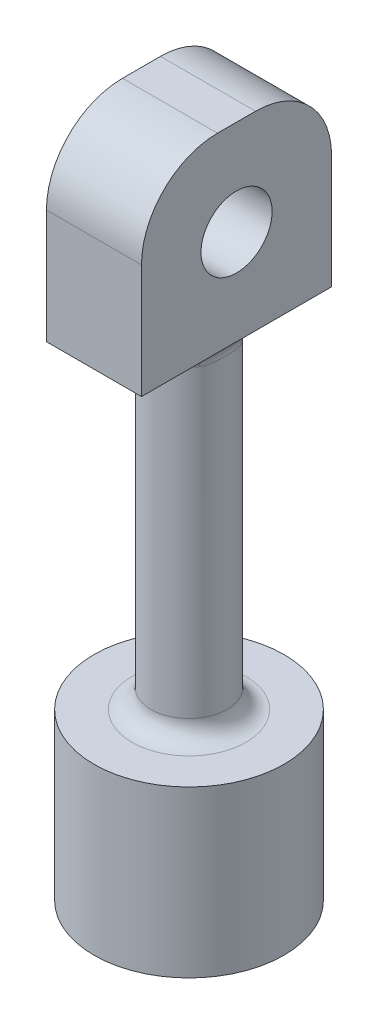
ISO-10303-21;
HEADER;
FILE_DESCRIPTION(('STEP AP214'),'2;1');
FILE_NAME('part.step','',(''),(''),'','','');
FILE_SCHEMA(('AUTOMOTIVE_DESIGN { 1 0 10303 214 1 1 1 1 }'));
ENDSEC;
DATA;
#1=APPLICATION_CONTEXT('core data for automotive mechanical design processes');
#2=APPLICATION_PROTOCOL_DEFINITION('international standard','automotive_design',2000,#1);
#3=PRODUCT_CONTEXT('',#1,'mechanical');
#4=PRODUCT('Part','Part','',(#3));
#5=PRODUCT_RELATED_PRODUCT_CATEGORY('part','',(#4));
#6=PRODUCT_DEFINITION_FORMATION('','',#4);
#7=PRODUCT_DEFINITION_CONTEXT('part definition',#1,'design');
#8=PRODUCT_DEFINITION('design','',#6,#7);
#9=PRODUCT_DEFINITION_SHAPE('','',#8);
#10=(LENGTH_UNIT() NAMED_UNIT(*) SI_UNIT(.MILLI.,.METRE.));
#11=(NAMED_UNIT(*) PLANE_ANGLE_UNIT() SI_UNIT($,.RADIAN.));
#12=(NAMED_UNIT(*) SI_UNIT($,.STERADIAN.) SOLID_ANGLE_UNIT());
#13=UNCERTAINTY_MEASURE_WITH_UNIT(LENGTH_MEASURE(1.E-05),#10,'distance_accuracy_value','');
#14=(GEOMETRIC_REPRESENTATION_CONTEXT(3) GLOBAL_UNCERTAINTY_ASSIGNED_CONTEXT((#13)) GLOBAL_UNIT_ASSIGNED_CONTEXT((#10,
#11,#12)) REPRESENTATION_CONTEXT('',''));
#15=CARTESIAN_POINT('',(0.,0.,0.));
#16=DIRECTION('',(0.,0.,1.));
#17=DIRECTION('',(1.,0.,0.));
#18=AXIS2_PLACEMENT_3D('',#15,#16,#17);
#19=CARTESIAN_POINT('',(0.,1.335,0.));
#20=DIRECTION('',(0.,1.,0.));
#21=DIRECTION('',(0.,0.,1.));
#22=AXIS2_PLACEMENT_3D('',#19,#20,#21);
#23=PLANE('',#22);
#24=DIRECTION('',(0.,0.,-1.));
#25=VECTOR('',#24,1.);
#26=CARTESIAN_POINT('',(0.125,1.335,-0.25));
#27=LINE('',#26,#25);
#28=CARTESIAN_POINT('',(0.125,1.335,-0.082915619758885));
#29=VERTEX_POINT('',#28);
#30=CARTESIAN_POINT('',(0.125,1.335,-0.25));
#31=VERTEX_POINT('',#30);
#32=EDGE_CURVE('E125',#29,#31,#27,.T.);
#33=ORIENTED_EDGE('',*,*,#32,.F.);
#34=CARTESIAN_POINT('',(0.,1.335,0.));
#35=DIRECTION('',(0.,1.,0.));
#36=DIRECTION('',(0.,0.,1.));
#37=AXIS2_PLACEMENT_3D('',#34,#35,#36);
#38=CIRCLE('',#37,0.15);
#39=CARTESIAN_POINT('',(-0.125,1.335,-0.082915619758885));
#40=VERTEX_POINT('',#39);
#41=EDGE_CURVE('E11',#29,#40,#38,.T.);
#42=ORIENTED_EDGE('',*,*,#41,.T.);
#43=DIRECTION('',(0.,0.,1.));
#44=VECTOR('',#43,1.);
#45=CARTESIAN_POINT('',(-0.125,1.335,-0.25));
#46=LINE('',#45,#44);
#47=CARTESIAN_POINT('',(-0.125,1.335,-0.25));
#48=VERTEX_POINT('',#47);
#49=EDGE_CURVE('E149',#48,#40,#46,.T.);
#50=ORIENTED_EDGE('',*,*,#49,.F.);
#51=DIRECTION('',(-1.,0.,0.));
#52=VECTOR('',#51,1.);
#53=CARTESIAN_POINT('',(-0.125,1.335,-0.25));
#54=LINE('',#53,#52);
#55=EDGE_CURVE('E142',#31,#48,#54,.T.);
#56=ORIENTED_EDGE('',*,*,#55,.F.);
#57=EDGE_LOOP('',(#33,#42,#50,#56));
#58=FACE_BOUND('',#57,.T.);
#59=ADVANCED_FACE('F41',(#58),#23,.F.);
#60=CARTESIAN_POINT('',(0.,0.435,0.));
#61=DIRECTION('',(0.,-1.,0.));
#62=DIRECTION('',(0.,0.,-1.));
#63=AXIS2_PLACEMENT_3D('',#60,#61,#62);
#64=CYLINDRICAL_SURFACE('',#63,0.25);
#65=CARTESIAN_POINT('',(0.,0.435,0.));
#66=DIRECTION('',(0.,1.,0.));
#67=DIRECTION('',(0.,0.,1.));
#68=AXIS2_PLACEMENT_3D('',#65,#66,#67);
#69=CIRCLE('',#68,0.25);
#70=CARTESIAN_POINT('',(0.,0.435,0.25));
#71=VERTEX_POINT('',#70);
#72=EDGE_CURVE('E174',#71,#71,#69,.T.);
#73=ORIENTED_EDGE('',*,*,#72,.F.);
#74=EDGE_LOOP('',(#73));
#75=FACE_BOUND('',#74,.T.);
#76=CARTESIAN_POINT('',(0.,0.,0.));
#77=DIRECTION('',(0.,1.,0.));
#78=DIRECTION('',(0.,0.,1.));
#79=AXIS2_PLACEMENT_3D('',#76,#77,#78);
#80=CIRCLE('',#79,0.25);
#81=CARTESIAN_POINT('',(0.,0.,0.25));
#82=VERTEX_POINT('',#81);
#83=EDGE_CURVE('E146',#82,#82,#80,.T.);
#84=ORIENTED_EDGE('',*,*,#83,.T.);
#85=EDGE_LOOP('',(#84));
#86=FACE_BOUND('',#85,.T.);
#87=ADVANCED_FACE('F361',(#75,#86),#64,.T.);
#88=CARTESIAN_POINT('',(0.,0.435,0.));
#89=DIRECTION('',(0.,1.,0.));
#90=DIRECTION('',(0.,0.,1.));
#91=AXIS2_PLACEMENT_3D('',#88,#89,#90);
#92=PLANE('',#91);
#93=CARTESIAN_POINT('',(0.,0.435,0.));
#94=DIRECTION('',(0.,1.,0.));
#95=DIRECTION('',(0.,0.,1.));
#96=AXIS2_PLACEMENT_3D('',#93,#94,#95);
#97=CIRCLE('',#96,0.15);
#98=CARTESIAN_POINT('',(0.,0.435,0.15));
#99=VERTEX_POINT('',#98);
#100=EDGE_CURVE('E303',#99,#99,#97,.F.);
#101=ORIENTED_EDGE('',*,*,#100,.T.);
#102=EDGE_LOOP('',(#101));
#103=FACE_BOUND('',#102,.T.);
#104=ORIENTED_EDGE('',*,*,#72,.T.);
#105=EDGE_LOOP('',(#104));
#106=FACE_BOUND('',#105,.T.);
#107=ADVANCED_FACE('F365',(#103,#106),#92,.T.);
#108=CARTESIAN_POINT('',(0.,0.,0.));
#109=DIRECTION('',(0.,1.,0.));
#110=DIRECTION('',(0.,0.,1.));
#111=AXIS2_PLACEMENT_3D('',#108,#109,#110);
#112=PLANE('',#111);
#113=ORIENTED_EDGE('',*,*,#83,.F.);
#114=EDGE_LOOP('',(#113));
#115=FACE_BOUND('',#114,.T.);
#116=ADVANCED_FACE('F370',(#115),#112,.F.);
#117=CARTESIAN_POINT('',(0.,1.335,0.));
#118=DIRECTION('',(0.,-1.,0.));
#119=DIRECTION('',(0.,0.,-1.));
#120=AXIS2_PLACEMENT_3D('',#117,#118,#119);
#121=CYLINDRICAL_SURFACE('',#120,0.1);
#122=CARTESIAN_POINT('',(0.,0.485,0.));
#123=DIRECTION('',(0.,1.,0.));
#124=DIRECTION('',(0.,0.,1.));
#125=AXIS2_PLACEMENT_3D('',#122,#123,#124);
#126=CIRCLE('',#125,0.1);
#127=CARTESIAN_POINT('',(0.,0.485,0.1));
#128=VERTEX_POINT('',#127);
#129=EDGE_CURVE('E307',#128,#128,#126,.T.);
#130=ORIENTED_EDGE('',*,*,#129,.T.);
#131=EDGE_LOOP('',(#130));
#132=FACE_BOUND('',#131,.T.);
#133=CARTESIAN_POINT('',(0.125,1.335,0.10856194725713));
#134=CARTESIAN_POINT('',(0.0850096782033544,1.35403583939084,0.0571162837268185));
#135=CARTESIAN_POINT('',(0.0690066135566093,1.28985383210074,0.072374631504753));
#136=CARTESIAN_POINT('',(0.125,1.335,0.105724168479342));
#137=CARTESIAN_POINT('',(0.0831957017639459,1.35170316919863,0.0580099933726405));
#138=CARTESIAN_POINT('',(0.0709959026641307,1.28843725584,0.070482778852119));
#139=CARTESIAN_POINT('',(0.125,1.335,0.102686668673819));
#140=CARTESIAN_POINT('',(0.0821809890806206,1.3490566128786,0.0584911358428412));
#141=CARTESIAN_POINT('',(0.0729507240944738,1.28739704937079,0.068457778960996));
#142=CARTESIAN_POINT('',(0.125,1.335,0.0963280489440128));
#143=CARTESIAN_POINT('',(0.0813724435440272,1.34388055681319,0.0585295506126141));
#144=CARTESIAN_POINT('',(0.0767054050172057,1.28591300630558,0.0642186991875025));
#145=CARTESIAN_POINT('',(0.125,1.335,0.093010538036136));
#146=CARTESIAN_POINT('',(0.0815131281205083,1.34135099110951,0.0581370739161317));
#147=CARTESIAN_POINT('',(0.078506771072767,1.28546253713962,0.0620070253150749));
#148=CARTESIAN_POINT('',(0.125,1.335,0.079010373943791));
#149=CARTESIAN_POINT('',(0.0834408034538218,1.33252361073601,0.0549034565275015));
#150=CARTESIAN_POINT('',(0.0854546022267336,1.28447308816901,0.0526735827594278));
#151=CARTESIAN_POINT('',(0.125,1.335,0.0673305657156687));
#152=CARTESIAN_POINT('',(0.0878162809667357,1.32764063347322,0.0488214738654433));
#153=CARTESIAN_POINT('',(0.0897851364635703,1.2856904332384,0.0448870438457601));
#154=CARTESIAN_POINT('',(0.125,1.335,0.0419979719113134));
#155=CARTESIAN_POINT('',(0.0950731532254085,1.32205084868934,0.0325534403305839));
#156=CARTESIAN_POINT('',(0.0964624191727258,1.28871923767388,0.0279986479032153));
#157=CARTESIAN_POINT('',(0.125,1.335,0.0282656627721752));
#158=CARTESIAN_POINT('',(0.0981925457759284,1.32111017020412,0.0219583922863398));
#159=CARTESIAN_POINT('',(0.0986582681023731,1.29056479303117,0.0188437751739174));
#160=CARTESIAN_POINT('',(0.125,1.335,0.0060122880577856));
#161=CARTESIAN_POINT('',(0.100097798358669,1.3205377690155,0.00474353422635026));
#162=CARTESIAN_POINT('',(0.100070499657983,1.29175447310882,0.0040081920429704));
#163=CARTESIAN_POINT('',(0.125,1.335,-0.00233894965746526));
#164=CARTESIAN_POINT('',(0.100179601405312,1.32051436326207,-0.00186314624087899));
#165=CARTESIAN_POINT('',(0.100138958115663,1.29181362539728,-0.001559299770624));
#166=CARTESIAN_POINT('',(0.125,1.335,-0.0189187693969847));
#167=CARTESIAN_POINT('',(0.0991471678284061,1.32081738622414,-0.0147012696194528));
#168=CARTESIAN_POINT('',(0.0993583161004837,1.2911528195719,-0.0126125129323461));
#169=CARTESIAN_POINT('',(0.125,1.335,-0.0271468464963167));
#170=CARTESIAN_POINT('',(0.09800656351114,1.32115153864871,-0.0210673364630614));
#171=CARTESIAN_POINT('',(0.0985061394611567,1.29043024943636,-0.0180978976638331));
#172=CARTESIAN_POINT('',(0.125,1.335,-0.0498614216109878));
#173=CARTESIAN_POINT('',(0.0933198913233842,1.32333549353212,-0.0378399985182552));
#174=CARTESIAN_POINT('',(0.0948434884943917,1.28791072842075,-0.0332409477413298));
#175=CARTESIAN_POINT('',(0.125,1.335,-0.0639884873456299));
#176=CARTESIAN_POINT('',(0.0883269820611773,1.32638135684997,-0.047385215565398));
#177=CARTESIAN_POINT('',(0.0910034571124553,1.28571803082568,-0.0426589915709393));
#178=CARTESIAN_POINT('',(0.125,1.335,-0.0809757940422197));
#179=CARTESIAN_POINT('',(0.0837571812340695,1.33386561831596,-0.0546992775339377));
#180=CARTESIAN_POINT('',(0.0842347574640492,1.28496235421669,-0.0539838626925906));
#181=CARTESIAN_POINT('',(0.125,1.335,-0.084878315980881));
#182=CARTESIAN_POINT('',(0.0827685593921063,1.336056110028,-0.0561085584009458));
#183=CARTESIAN_POINT('',(0.0825086489906885,1.28493837909165,-0.0565855439814985));
#184=CARTESIAN_POINT('',(0.125,1.335,-0.0924270554819607));
#185=CARTESIAN_POINT('',(0.0815225350568603,1.34093492876437,-0.0580616156547578));
#186=CARTESIAN_POINT('',(0.0788230421730658,1.28538233300948,-0.0616180369797594));
#187=CARTESIAN_POINT('',(0.125,1.335,-0.0960716871019849));
#188=CARTESIAN_POINT('',(0.0813039904972026,1.34365472343558,-0.0585598165198814));
#189=CARTESIAN_POINT('',(0.0768622708565444,1.28585306376332,-0.0640477913942094));
#190=CARTESIAN_POINT('',(0.125,1.335,-0.099546749880505));
#191=CARTESIAN_POINT('',(0.0817726615139244,1.34644082893277,-0.0585104253278344));
#192=CARTESIAN_POINT('',(0.0748047668957242,1.28666426789974,-0.0663644999203366));
#193=(BOUNDED_SURFACE() B_SPLINE_SURFACE(3,2,((#133,#134,#135),(#136,#137,#138),(#139,#140,
#141),(#142,#143,#144),(#145,#146,#147),(#148,#149,#150),(#151,#152,#153),(#154,#155,#156),
(#157,#158,#159),(#160,#161,#162),(#163,#164,#165),(#166,#167,#168),(#169,#170,#171),(#172,#173,
#174),(#175,#176,#177),(#178,#179,#180),(#181,#182,#183),(#184,#185,#186),(#187,#188,#189),
(#190,#191,#192)),.UNSPECIFIED.,.F.,.F.,.F.) B_SPLINE_SURFACE_WITH_KNOTS((4,2,2,2,2,2,2,2,2,4),
(3,3),(0.,0.0130040609143609,0.0258605762789966,0.0653974877027271,0.107560932638332,
0.132451060517195,0.157424613048316,0.202733269596913,0.216746329476958,0.230839180611311),(0.,
1.),.UNSPECIFIED.) GEOMETRIC_REPRESENTATION_ITEM() RATIONAL_B_SPLINE_SURFACE(((1.,
0.59304657298147,1.),(1.,0.606779462805589,1.),(1.,0.621334840894185,1.),(1.,0.650726469007366,
1.),(1.,0.665557658450866,1.),(1.,0.724535947416547,1.),(1.,0.765648180301429,1.),(1.,
0.830297574603736,1.),(1.,0.852485741784741,1.),(1.,0.866736952772142,1.),(1.,0.867417588593249,
1.),(1.,0.859557397145546,1.),(1.,0.850985654500493,1.),(1.,0.814457334485753,1.),(1.,
0.776399662582596,1.),(1.,0.715014348013355,1.),(1.,0.699669472161448,1.),(1.,0.668137116196066,
1.),(1.,0.651945335757425,1.),(1.,0.635848556145245,1.))) REPRESENTATION_ITEM('') SURFACE());
#194=CARTESIAN_POINT('',(0.0748047668957242,1.28666426789974,-0.0663644999203366));
#195=CARTESIAN_POINT('',(0.0768622708565444,1.28585306376332,-0.0640477913942094));
#196=CARTESIAN_POINT('',(0.0788230421730658,1.28538233300948,-0.0616180369797594));
#197=CARTESIAN_POINT('',(0.0825086489906885,1.28493837909165,-0.0565855439814985));
#198=CARTESIAN_POINT('',(0.0842347574640492,1.28496235421669,-0.0539838626925906));
#199=CARTESIAN_POINT('',(0.0910034571124553,1.28571803082568,-0.0426589915709393));
#200=CARTESIAN_POINT('',(0.0948434884943917,1.28791072842075,-0.0332409477413298));
#201=CARTESIAN_POINT('',(0.0985061394611568,1.29043024943636,-0.0180978976638331));
#202=CARTESIAN_POINT('',(0.0993583161004837,1.2911528195719,-0.0126125129323461));
#203=CARTESIAN_POINT('',(0.100138958115663,1.29181362539728,-0.001559299770624));
#204=CARTESIAN_POINT('',(0.100070499657983,1.29175447310882,0.00400819204297041));
#205=CARTESIAN_POINT('',(0.0986582681023731,1.29056479303117,0.0188437751739174));
#206=CARTESIAN_POINT('',(0.0964624191727258,1.28871923767388,0.0279986479032153));
#207=CARTESIAN_POINT('',(0.0897851364635703,1.2856904332384,0.0448870438457601));
#208=CARTESIAN_POINT('',(0.0854546022267336,1.28447308816901,0.0526735827594279));
#209=CARTESIAN_POINT('',(0.078506771072767,1.28546253713962,0.0620070253150749));
#210=CARTESIAN_POINT('',(0.0767054050172057,1.28591300630558,0.0642186991875025));
#211=CARTESIAN_POINT('',(0.0729507240944738,1.28739704937079,0.0684577789609959));
#212=CARTESIAN_POINT('',(0.0709959026641307,1.28843725584,0.070482778852119));
#213=CARTESIAN_POINT('',(0.0690066135566093,1.28985383210074,0.072374631504753));
#214=B_SPLINE_CURVE_WITH_KNOTS('',3,(#194,#195,#196,#197,#198,#199,#200,#201,#202,#203,#204,
#205,#206,#207,#208,#209,#210,#211,#212,#213),.UNSPECIFIED.,.F.,.F.,(4,2,2,2,2,2,2,2,2,4),(0.,
0.0140928511343531,0.0281059110143974,0.0734145675629953,0.0983881200941162,0.123278247972978,
0.165441692908584,0.204978604332314,0.21783511969695,0.230839180611311),.UNSPECIFIED.);
#215=CARTESIAN_POINT('',(0.0833333333333333,1.285,-0.0552770798392567));
#216=VERTEX_POINT('',#215);
#217=CARTESIAN_POINT('',(0.0833333333333333,1.285,0.0552770798392567));
#218=VERTEX_POINT('',#217);
#219=EDGE_CURVE('E206',#216,#218,#214,.T.);
#220=ORIENTED_EDGE('',*,*,#219,.T.);
#221=CARTESIAN_POINT('',(0.,1.285,0.));
#222=DIRECTION('',(0.,1.,0.));
#223=DIRECTION('',(0.,0.,1.));
#224=AXIS2_PLACEMENT_3D('',#221,#222,#223);
#225=CIRCLE('',#224,0.1);
#226=CARTESIAN_POINT('',(-0.0833333333333333,1.285,0.0552770798392567));
#227=VERTEX_POINT('',#226);
#228=EDGE_CURVE('E311',#218,#227,#225,.F.);
#229=ORIENTED_EDGE('',*,*,#228,.T.);
#230=CARTESIAN_POINT('',(-0.125,1.335,-0.10856194725713));
#231=CARTESIAN_POINT('',(-0.0850096782033544,1.35403583939084,-0.0571162837268185));
#232=CARTESIAN_POINT('',(-0.0690066135566093,1.28985383210074,-0.072374631504753));
#233=CARTESIAN_POINT('',(-0.125,1.335,-0.105724168479342));
#234=CARTESIAN_POINT('',(-0.0831957017639459,1.35170316919863,-0.0580099933726406));
#235=CARTESIAN_POINT('',(-0.0709959026641307,1.28843725584,-0.070482778852119));
#236=CARTESIAN_POINT('',(-0.125,1.335,-0.102686668673819));
#237=CARTESIAN_POINT('',(-0.0821809890806206,1.3490566128786,-0.0584911358428412));
#238=CARTESIAN_POINT('',(-0.0729507240944738,1.28739704937079,-0.068457778960996));
#239=CARTESIAN_POINT('',(-0.125,1.335,-0.0963280489440128));
#240=CARTESIAN_POINT('',(-0.0813724435440272,1.34388055681319,-0.0585295506126141));
#241=CARTESIAN_POINT('',(-0.0767054050172057,1.28591300630558,-0.0642186991875025));
#242=CARTESIAN_POINT('',(-0.125,1.335,-0.093010538036136));
#243=CARTESIAN_POINT('',(-0.0815131281205083,1.34135099110951,-0.0581370739161317));
#244=CARTESIAN_POINT('',(-0.078506771072767,1.28546253713962,-0.0620070253150749));
#245=CARTESIAN_POINT('',(-0.125,1.335,-0.079010373943791));
#246=CARTESIAN_POINT('',(-0.0834408034538218,1.33252361073601,-0.0549034565275015));
#247=CARTESIAN_POINT('',(-0.0854546022267337,1.28447308816901,-0.0526735827594278));
#248=CARTESIAN_POINT('',(-0.125,1.335,-0.0673305657156687));
#249=CARTESIAN_POINT('',(-0.0878162809667357,1.32764063347322,-0.0488214738654433));
#250=CARTESIAN_POINT('',(-0.0897851364635703,1.2856904332384,-0.04488704384576));
#251=CARTESIAN_POINT('',(-0.125,1.335,-0.0419979719113133));
#252=CARTESIAN_POINT('',(-0.0950731532254085,1.32205084868934,-0.0325534403305839));
#253=CARTESIAN_POINT('',(-0.0964624191727258,1.28871923767388,-0.0279986479032152));
#254=CARTESIAN_POINT('',(-0.125,1.335,-0.0282656627721752));
#255=CARTESIAN_POINT('',(-0.0981925457759284,1.32111017020412,-0.0219583922863398));
#256=CARTESIAN_POINT('',(-0.0986582681023731,1.29056479303117,-0.0188437751739173));
#257=CARTESIAN_POINT('',(-0.125,1.335,-0.00601228805778554));
#258=CARTESIAN_POINT('',(-0.100097798358669,1.3205377690155,-0.00474353422635021));
#259=CARTESIAN_POINT('',(-0.100070499657983,1.29175447310882,-0.00400819204297037));
#260=CARTESIAN_POINT('',(-0.125,1.335,0.00233894965746531));
#261=CARTESIAN_POINT('',(-0.100179601405312,1.32051436326207,0.00186314624087904));
#262=CARTESIAN_POINT('',(-0.100138958115663,1.29181362539728,0.00155929977062404));
#263=CARTESIAN_POINT('',(-0.125,1.335,0.0189187693969848));
#264=CARTESIAN_POINT('',(-0.0991471678284061,1.32081738622414,0.0147012696194528));
#265=CARTESIAN_POINT('',(-0.0993583161004837,1.2911528195719,0.0126125129323461));
#266=CARTESIAN_POINT('',(-0.125,1.335,0.0271468464963167));
#267=CARTESIAN_POINT('',(-0.09800656351114,1.32115153864871,0.0210673364630614));
#268=CARTESIAN_POINT('',(-0.0985061394611568,1.29043024943636,0.0180978976638331));
#269=CARTESIAN_POINT('',(-0.125,1.335,0.0498614216109879));
#270=CARTESIAN_POINT('',(-0.0933198913233842,1.32333549353212,0.0378399985182553));
#271=CARTESIAN_POINT('',(-0.0948434884943917,1.28791072842075,0.0332409477413298));
#272=CARTESIAN_POINT('',(-0.125,1.335,0.06398848734563));
#273=CARTESIAN_POINT('',(-0.0883269820611773,1.32638135684997,0.0473852155653981));
#274=CARTESIAN_POINT('',(-0.0910034571124553,1.28571803082568,0.0426589915709394));
#275=CARTESIAN_POINT('',(-0.125,1.335,0.0809757940422198));
#276=CARTESIAN_POINT('',(-0.0837571812340695,1.33386561831596,0.0546992775339377));
#277=CARTESIAN_POINT('',(-0.0842347574640492,1.28496235421669,0.0539838626925907));
#278=CARTESIAN_POINT('',(-0.125,1.335,0.084878315980881));
#279=CARTESIAN_POINT('',(-0.0827685593921063,1.336056110028,0.0561085584009458));
#280=CARTESIAN_POINT('',(-0.0825086489906885,1.28493837909165,0.0565855439814984));
#281=CARTESIAN_POINT('',(-0.125,1.335,0.0924270554819607));
#282=CARTESIAN_POINT('',(-0.0815225350568603,1.34093492876437,0.0580616156547578));
#283=CARTESIAN_POINT('',(-0.0788230421730658,1.28538233300948,0.0616180369797594));
#284=CARTESIAN_POINT('',(-0.125,1.335,0.0960716871019849));
#285=CARTESIAN_POINT('',(-0.0813039904972027,1.34365472343558,0.0585598165198814));
#286=CARTESIAN_POINT('',(-0.0768622708565444,1.28585306376332,0.0640477913942094));
#287=CARTESIAN_POINT('',(-0.125,1.335,0.099546749880505));
#288=CARTESIAN_POINT('',(-0.0817726615139244,1.34644082893277,0.0585104253278344));
#289=CARTESIAN_POINT('',(-0.0748047668957242,1.28666426789974,0.0663644999203367));
#290=(BOUNDED_SURFACE() B_SPLINE_SURFACE(3,2,((#230,#231,#232),(#233,#234,#235),(#236,#237,
#238),(#239,#240,#241),(#242,#243,#244),(#245,#246,#247),(#248,#249,#250),(#251,#252,#253),
(#254,#255,#256),(#257,#258,#259),(#260,#261,#262),(#263,#264,#265),(#266,#267,#268),(#269,#270,
#271),(#272,#273,#274),(#275,#276,#277),(#278,#279,#280),(#281,#282,#283),(#284,#285,#286),
(#287,#288,#289)),.UNSPECIFIED.,.F.,.F.,.F.) B_SPLINE_SURFACE_WITH_KNOTS((4,2,2,2,2,2,2,2,2,4),
(3,3),(0.,0.0130040609143609,0.0258605762789966,0.0653974877027272,0.107560932638332,
0.132451060517195,0.157424613048316,0.202733269596913,0.216746329476958,0.230839180611311),(0.,
1.),.UNSPECIFIED.) GEOMETRIC_REPRESENTATION_ITEM() RATIONAL_B_SPLINE_SURFACE(((1.,
0.59304657298147,1.),(1.,0.606779462805589,1.),(1.,0.621334840894185,1.),(1.,0.650726469007367,
1.),(1.,0.665557658450866,1.),(1.,0.724535947416548,1.),(1.,0.765648180301429,1.),(1.,
0.830297574603736,1.),(1.,0.852485741784741,1.),(1.,0.866736952772142,1.),(1.,0.867417588593249,
1.),(1.,0.859557397145546,1.),(1.,0.850985654500493,1.),(1.,0.814457334485753,1.),(1.,
0.776399662582596,1.),(1.,0.715014348013355,1.),(1.,0.699669472161448,1.),(1.,0.668137116196066,
1.),(1.,0.651945335757425,1.),(1.,0.635848556145245,1.))) REPRESENTATION_ITEM('') SURFACE());
#291=CARTESIAN_POINT('',(-0.0748047668957242,1.28666426789974,0.0663644999203367));
#292=CARTESIAN_POINT('',(-0.0768622708565444,1.28585306376332,0.0640477913942094));
#293=CARTESIAN_POINT('',(-0.0788230421730658,1.28538233300948,0.0616180369797594));
#294=CARTESIAN_POINT('',(-0.0825086489906885,1.28493837909165,0.0565855439814985));
#295=CARTESIAN_POINT('',(-0.0842347574640492,1.28496235421669,0.0539838626925907));
#296=CARTESIAN_POINT('',(-0.0910034571124553,1.28571803082568,0.0426589915709394));
#297=CARTESIAN_POINT('',(-0.0948434884943917,1.28791072842075,0.0332409477413298));
#298=CARTESIAN_POINT('',(-0.0985061394611568,1.29043024943636,0.0180978976638331));
#299=CARTESIAN_POINT('',(-0.0993583161004837,1.2911528195719,0.0126125129323461));
#300=CARTESIAN_POINT('',(-0.100138958115663,1.29181362539728,0.00155929977062404));
#301=CARTESIAN_POINT('',(-0.100070499657983,1.29175447310882,-0.00400819204297037));
#302=CARTESIAN_POINT('',(-0.0986582681023731,1.29056479303117,-0.0188437751739173));
#303=CARTESIAN_POINT('',(-0.0964624191727258,1.28871923767388,-0.0279986479032152));
#304=CARTESIAN_POINT('',(-0.0897851364635703,1.2856904332384,-0.04488704384576));
#305=CARTESIAN_POINT('',(-0.0854546022267337,1.28447308816901,-0.0526735827594279));
#306=CARTESIAN_POINT('',(-0.078506771072767,1.28546253713962,-0.0620070253150749));
#307=CARTESIAN_POINT('',(-0.0767054050172057,1.28591300630558,-0.0642186991875025));
#308=CARTESIAN_POINT('',(-0.0729507240944738,1.28739704937079,-0.0684577789609959));
#309=CARTESIAN_POINT('',(-0.0709959026641307,1.28843725584,-0.070482778852119));
#310=CARTESIAN_POINT('',(-0.0690066135566093,1.28985383210074,-0.072374631504753));
#311=B_SPLINE_CURVE_WITH_KNOTS('',3,(#291,#292,#293,#294,#295,#296,#297,#298,#299,#300,#301,
#302,#303,#304,#305,#306,#307,#308,#309,#310),.UNSPECIFIED.,.F.,.F.,(4,2,2,2,2,2,2,2,2,4),(0.,
0.0140928511343532,0.0281059110143974,0.0734145675629953,0.0983881200941162,0.123278247972978,
0.165441692908584,0.204978604332314,0.21783511969695,0.230839180611311),.UNSPECIFIED.);
#312=CARTESIAN_POINT('',(-0.0833333333333333,1.285,-0.0552770798392567));
#313=VERTEX_POINT('',#312);
#314=EDGE_CURVE('E313',#227,#313,#311,.T.);
#315=ORIENTED_EDGE('',*,*,#314,.T.);
#316=CARTESIAN_POINT('',(0.,1.285,0.));
#317=DIRECTION('',(0.,1.,0.));
#318=DIRECTION('',(0.,0.,1.));
#319=AXIS2_PLACEMENT_3D('',#316,#317,#318);
#320=CIRCLE('',#319,0.1);
#321=EDGE_CURVE('E216',#313,#216,#320,.F.);
#322=ORIENTED_EDGE('',*,*,#321,.T.);
#323=EDGE_LOOP('',(#220,#229,#315,#322));
#324=FACE_BOUND('',#323,.T.);
#325=ADVANCED_FACE('F218',(#132,#324),#121,.T.);
#326=CARTESIAN_POINT('',(0.125,1.835,-0.25));
#327=DIRECTION('',(-1.,0.,0.));
#328=DIRECTION('',(0.,0.,1.));
#329=AXIS2_PLACEMENT_3D('',#326,#327,#328);
#330=PLANE('',#329);
#331=CARTESIAN_POINT('',(0.125,1.585,0.));
#332=DIRECTION('',(1.,0.,0.));
#333=DIRECTION('',(0.,0.,-1.));
#334=AXIS2_PLACEMENT_3D('',#331,#332,#333);
#335=CIRCLE('',#334,0.0935);
#336=CARTESIAN_POINT('',(0.125,1.585,-0.0934999999999999));
#337=VERTEX_POINT('',#336);
#338=EDGE_CURVE('E282',#337,#337,#335,.T.);
#339=ORIENTED_EDGE('',*,*,#338,.F.);
#340=EDGE_LOOP('',(#339));
#341=FACE_BOUND('',#340,.T.);
#342=DIRECTION('',(0.,-1.,0.));
#343=VECTOR('',#342,1.);
#344=CARTESIAN_POINT('',(0.125,1.835,-0.25));
#345=LINE('',#344,#343);
#346=CARTESIAN_POINT('',(0.125,1.635,-0.25));
#347=VERTEX_POINT('',#346);
#348=EDGE_CURVE('E128',#347,#31,#345,.T.);
#349=ORIENTED_EDGE('',*,*,#348,.F.);
#350=CARTESIAN_POINT('',(0.125,1.635,-0.0499999999999999));
#351=DIRECTION('',(-1.,0.,0.));
#352=DIRECTION('',(0.,0.,1.));
#353=AXIS2_PLACEMENT_3D('',#350,#351,#352);
#354=CIRCLE('',#353,0.2);
#355=CARTESIAN_POINT('',(0.125,1.835,-0.0499999999999999));
#356=VERTEX_POINT('',#355);
#357=EDGE_CURVE('E200',#347,#356,#354,.F.);
#358=ORIENTED_EDGE('',*,*,#357,.T.);
#359=DIRECTION('',(0.,0.,-1.));
#360=VECTOR('',#359,1.);
#361=CARTESIAN_POINT('',(0.125,1.835,-0.25));
#362=LINE('',#361,#360);
#363=CARTESIAN_POINT('',(0.125,1.835,0.0500000000000001));
#364=VERTEX_POINT('',#363);
#365=EDGE_CURVE('E163',#364,#356,#362,.T.);
#366=ORIENTED_EDGE('',*,*,#365,.F.);
#367=CARTESIAN_POINT('',(0.125,1.635,0.0500000000000001));
#368=DIRECTION('',(-1.,0.,0.));
#369=DIRECTION('',(0.,0.,1.));
#370=AXIS2_PLACEMENT_3D('',#367,#368,#369);
#371=CIRCLE('',#370,0.2);
#372=CARTESIAN_POINT('',(0.125,1.635,0.25));
#373=VERTEX_POINT('',#372);
#374=EDGE_CURVE('E197',#364,#373,#371,.F.);
#375=ORIENTED_EDGE('',*,*,#374,.T.);
#376=DIRECTION('',(0.,-1.,0.));
#377=VECTOR('',#376,1.);
#378=CARTESIAN_POINT('',(0.125,1.835,0.25));
#379=LINE('',#378,#377);
#380=CARTESIAN_POINT('',(0.125,1.335,0.25));
#381=VERTEX_POINT('',#380);
#382=EDGE_CURVE('E164',#373,#381,#379,.T.);
#383=ORIENTED_EDGE('',*,*,#382,.T.);
#384=CARTESIAN_POINT('',(0.125,1.335,0.082915619758885));
#385=VERTEX_POINT('',#384);
#386=EDGE_CURVE('E137',#381,#385,#27,.T.);
#387=ORIENTED_EDGE('',*,*,#386,.T.);
#388=EDGE_CURVE('E132',#385,#29,#27,.T.);
#389=ORIENTED_EDGE('',*,*,#388,.T.);
#390=ORIENTED_EDGE('',*,*,#32,.T.);
#391=EDGE_LOOP('',(#349,#358,#366,#375,#383,#387,#389,#390));
#392=FACE_BOUND('',#391,.T.);
#393=ADVANCED_FACE('F127',(#341,#392),#330,.F.);
#394=CARTESIAN_POINT('',(-0.125,1.835,-0.25));
#395=DIRECTION('',(0.,0.,1.));
#396=DIRECTION('',(1.,0.,0.));
#397=AXIS2_PLACEMENT_3D('',#394,#395,#396);
#398=PLANE('',#397);
#399=DIRECTION('',(0.,-1.,0.));
#400=VECTOR('',#399,1.);
#401=CARTESIAN_POINT('',(-0.125,1.835,-0.25));
#402=LINE('',#401,#400);
#403=CARTESIAN_POINT('',(-0.125,1.635,-0.25));
#404=VERTEX_POINT('',#403);
#405=EDGE_CURVE('E147',#404,#48,#402,.T.);
#406=ORIENTED_EDGE('',*,*,#405,.F.);
#407=DIRECTION('',(-1.,0.,0.));
#408=VECTOR('',#407,1.);
#409=CARTESIAN_POINT('',(0.125,1.635,-0.25));
#410=LINE('',#409,#408);
#411=EDGE_CURVE('E144',#404,#347,#410,.F.);
#412=ORIENTED_EDGE('',*,*,#411,.T.);
#413=ORIENTED_EDGE('',*,*,#348,.T.);
#414=ORIENTED_EDGE('',*,*,#55,.T.);
#415=EDGE_LOOP('',(#406,#412,#413,#414));
#416=FACE_BOUND('',#415,.T.);
#417=ADVANCED_FACE('F141',(#416),#398,.F.);
#418=CARTESIAN_POINT('',(-0.125,1.835,-0.25));
#419=DIRECTION('',(1.,0.,0.));
#420=DIRECTION('',(0.,0.,-1.));
#421=AXIS2_PLACEMENT_3D('',#418,#419,#420);
#422=PLANE('',#421);
#423=CARTESIAN_POINT('',(-0.125,1.585,0.));
#424=DIRECTION('',(1.,0.,0.));
#425=DIRECTION('',(0.,0.,-1.));
#426=AXIS2_PLACEMENT_3D('',#423,#424,#425);
#427=CIRCLE('',#426,0.0935);
#428=CARTESIAN_POINT('',(-0.125,1.585,-0.0934999999999998));
#429=VERTEX_POINT('',#428);
#430=EDGE_CURVE('E135',#429,#429,#427,.T.);
#431=ORIENTED_EDGE('',*,*,#430,.T.);
#432=EDGE_LOOP('',(#431));
#433=FACE_BOUND('',#432,.T.);
#434=DIRECTION('',(0.,0.,1.));
#435=VECTOR('',#434,1.);
#436=CARTESIAN_POINT('',(-0.125,1.835,-0.25));
#437=LINE('',#436,#435);
#438=CARTESIAN_POINT('',(-0.125,1.835,-0.0499999999999999));
#439=VERTEX_POINT('',#438);
#440=CARTESIAN_POINT('',(-0.125,1.835,0.0500000000000001));
#441=VERTEX_POINT('',#440);
#442=EDGE_CURVE('E168',#439,#441,#437,.T.);
#443=ORIENTED_EDGE('',*,*,#442,.F.);
#444=CARTESIAN_POINT('',(-0.125,1.635,-0.0499999999999999));
#445=DIRECTION('',(1.,0.,0.));
#446=DIRECTION('',(0.,0.,-1.));
#447=AXIS2_PLACEMENT_3D('',#444,#445,#446);
#448=CIRCLE('',#447,0.2);
#449=EDGE_CURVE('E192',#439,#404,#448,.F.);
#450=ORIENTED_EDGE('',*,*,#449,.T.);
#451=ORIENTED_EDGE('',*,*,#405,.T.);
#452=ORIENTED_EDGE('',*,*,#49,.T.);
#453=CARTESIAN_POINT('',(-0.125,1.335,0.082915619758885));
#454=VERTEX_POINT('',#453);
#455=EDGE_CURVE('E154',#40,#454,#46,.T.);
#456=ORIENTED_EDGE('',*,*,#455,.T.);
#457=CARTESIAN_POINT('',(-0.125,1.335,0.25));
#458=VERTEX_POINT('',#457);
#459=EDGE_CURVE('E63',#454,#458,#46,.T.);
#460=ORIENTED_EDGE('',*,*,#459,.T.);
#461=DIRECTION('',(0.,-1.,0.));
#462=VECTOR('',#461,1.);
#463=CARTESIAN_POINT('',(-0.125,1.835,0.25));
#464=LINE('',#463,#462);
#465=CARTESIAN_POINT('',(-0.125,1.635,0.25));
#466=VERTEX_POINT('',#465);
#467=EDGE_CURVE('E167',#466,#458,#464,.T.);
#468=ORIENTED_EDGE('',*,*,#467,.F.);
#469=CARTESIAN_POINT('',(-0.125,1.635,0.0500000000000001));
#470=DIRECTION('',(1.,0.,0.));
#471=DIRECTION('',(0.,0.,-1.));
#472=AXIS2_PLACEMENT_3D('',#469,#470,#471);
#473=CIRCLE('',#472,0.2);
#474=EDGE_CURVE('E189',#466,#441,#473,.F.);
#475=ORIENTED_EDGE('',*,*,#474,.T.);
#476=EDGE_LOOP('',(#443,#450,#451,#452,#456,#460,#468,#475));
#477=FACE_BOUND('',#476,.T.);
#478=ADVANCED_FACE('F275',(#433,#477),#422,.F.);
#479=CARTESIAN_POINT('',(-0.125,1.835,0.25));
#480=DIRECTION('',(0.,0.,-1.));
#481=DIRECTION('',(-1.,0.,0.));
#482=AXIS2_PLACEMENT_3D('',#479,#480,#481);
#483=PLANE('',#482);
#484=ORIENTED_EDGE('',*,*,#382,.F.);
#485=DIRECTION('',(1.,0.,0.));
#486=VECTOR('',#485,1.);
#487=CARTESIAN_POINT('',(-0.125,1.635,0.25));
#488=LINE('',#487,#486);
#489=EDGE_CURVE('E203',#373,#466,#488,.F.);
#490=ORIENTED_EDGE('',*,*,#489,.T.);
#491=ORIENTED_EDGE('',*,*,#467,.T.);
#492=DIRECTION('',(1.,0.,0.));
#493=VECTOR('',#492,1.);
#494=CARTESIAN_POINT('',(-0.125,1.335,0.25));
#495=LINE('',#494,#493);
#496=EDGE_CURVE('E159',#458,#381,#495,.T.);
#497=ORIENTED_EDGE('',*,*,#496,.T.);
#498=EDGE_LOOP('',(#484,#490,#491,#497));
#499=FACE_BOUND('',#498,.T.);
#500=ADVANCED_FACE('F346',(#499),#483,.F.);
#501=CARTESIAN_POINT('',(0.,1.835,0.));
#502=DIRECTION('',(0.,1.,0.));
#503=DIRECTION('',(0.,0.,1.));
#504=AXIS2_PLACEMENT_3D('',#501,#502,#503);
#505=PLANE('',#504);
#506=ORIENTED_EDGE('',*,*,#365,.T.);
#507=DIRECTION('',(-1.,0.,0.));
#508=VECTOR('',#507,1.);
#509=CARTESIAN_POINT('',(-0.125,1.835,-0.0499999999999999));
#510=LINE('',#509,#508);
#511=EDGE_CURVE('E185',#356,#439,#510,.T.);
#512=ORIENTED_EDGE('',*,*,#511,.T.);
#513=ORIENTED_EDGE('',*,*,#442,.T.);
#514=DIRECTION('',(1.,0.,0.));
#515=VECTOR('',#514,1.);
#516=CARTESIAN_POINT('',(0.125,1.835,0.0500000000000001));
#517=LINE('',#516,#515);
#518=EDGE_CURVE('E178',#441,#364,#517,.T.);
#519=ORIENTED_EDGE('',*,*,#518,.T.);
#520=EDGE_LOOP('',(#506,#512,#513,#519));
#521=FACE_BOUND('',#520,.T.);
#522=ADVANCED_FACE('F337',(#521),#505,.T.);
#523=ORIENTED_EDGE('',*,*,#459,.F.);
#524=CARTESIAN_POINT('',(0.,1.335,0.));
#525=DIRECTION('',(0.,1.,0.));
#526=DIRECTION('',(0.,0.,1.));
#527=AXIS2_PLACEMENT_3D('',#524,#525,#526);
#528=CIRCLE('',#527,0.15);
#529=EDGE_CURVE('E55',#454,#385,#528,.T.);
#530=ORIENTED_EDGE('',*,*,#529,.T.);
#531=ORIENTED_EDGE('',*,*,#386,.F.);
#532=ORIENTED_EDGE('',*,*,#496,.F.);
#533=EDGE_LOOP('',(#523,#530,#531,#532));
#534=FACE_BOUND('',#533,.T.);
#535=ADVANCED_FACE('F271',(#534),#23,.F.);
#536=CARTESIAN_POINT('',(0.,1.635,-0.0499999999999999));
#537=DIRECTION('',(1.,0.,0.));
#538=DIRECTION('',(0.,0.,-1.));
#539=AXIS2_PLACEMENT_3D('',#536,#537,#538);
#540=CYLINDRICAL_SURFACE('',#539,0.2);
#541=ORIENTED_EDGE('',*,*,#357,.F.);
#542=ORIENTED_EDGE('',*,*,#411,.F.);
#543=ORIENTED_EDGE('',*,*,#449,.F.);
#544=ORIENTED_EDGE('',*,*,#511,.F.);
#545=EDGE_LOOP('',(#541,#542,#543,#544));
#546=FACE_BOUND('',#545,.T.);
#547=ADVANCED_FACE('F352',(#546),#540,.T.);
#548=CARTESIAN_POINT('',(0.,1.635,0.0500000000000001));
#549=DIRECTION('',(-1.,0.,0.));
#550=DIRECTION('',(0.,0.,1.));
#551=AXIS2_PLACEMENT_3D('',#548,#549,#550);
#552=CYLINDRICAL_SURFACE('',#551,0.2);
#553=ORIENTED_EDGE('',*,*,#474,.F.);
#554=ORIENTED_EDGE('',*,*,#489,.F.);
#555=ORIENTED_EDGE('',*,*,#374,.F.);
#556=ORIENTED_EDGE('',*,*,#518,.F.);
#557=EDGE_LOOP('',(#553,#554,#555,#556));
#558=FACE_BOUND('',#557,.T.);
#559=ADVANCED_FACE('F226',(#558),#552,.T.);
#560=CARTESIAN_POINT('',(-0.125,1.585,0.));
#561=DIRECTION('',(1.,0.,0.));
#562=DIRECTION('',(0.,0.,-1.));
#563=AXIS2_PLACEMENT_3D('',#560,#561,#562);
#564=CYLINDRICAL_SURFACE('',#563,0.0935);
#565=ORIENTED_EDGE('',*,*,#430,.F.);
#566=EDGE_LOOP('',(#565));
#567=FACE_BOUND('',#566,.T.);
#568=ORIENTED_EDGE('',*,*,#338,.T.);
#569=EDGE_LOOP('',(#568));
#570=FACE_BOUND('',#569,.T.);
#571=ADVANCED_FACE('F358',(#567,#570),#564,.F.);
#572=CARTESIAN_POINT('',(0.,0.485,0.));
#573=DIRECTION('',(0.,1.,0.));
#574=DIRECTION('',(0.,0.,1.));
#575=AXIS2_PLACEMENT_3D('',#572,#573,#574);
#576=TOROIDAL_SURFACE('',#575,0.15,0.05);
#577=ORIENTED_EDGE('',*,*,#100,.F.);
#578=EDGE_LOOP('',(#577));
#579=FACE_BOUND('',#578,.T.);
#580=ORIENTED_EDGE('',*,*,#129,.F.);
#581=EDGE_LOOP('',(#580));
#582=FACE_BOUND('',#581,.T.);
#583=ADVANCED_FACE('F238',(#579,#582),#576,.F.);
#584=CARTESIAN_POINT('',(-0.125,1.285,-0.0829156197588846));
#585=DIRECTION('',(0.552770798392564,0.,-0.833333333333335));
#586=DIRECTION('',(-0.833333333333335,0.,-0.552770798392564));
#587=AXIS2_PLACEMENT_3D('',#584,#585,#586);
#588=CIRCLE('',#587,0.05);
#589=EDGE_CURVE('E252',#313,#40,#588,.F.);
#590=ORIENTED_EDGE('',*,*,#589,.F.);
#591=ORIENTED_EDGE('',*,*,#314,.F.);
#592=CARTESIAN_POINT('',(-0.125000000000017,1.28499999999999,0.0829156197588985));
#593=DIRECTION('',(-0.552770798392576,1.90082335458789E-13,-0.833333333333327));
#594=DIRECTION('',(-0.833333333333327,0.,0.552770798392576));
#595=AXIS2_PLACEMENT_3D('',#592,#593,#594);
#596=CIRCLE('',#595,0.05);
#597=EDGE_CURVE('E279',#454,#227,#596,.T.);
#598=ORIENTED_EDGE('',*,*,#597,.F.);
#599=ORIENTED_EDGE('',*,*,#455,.F.);
#600=EDGE_LOOP('',(#590,#591,#598,#599));
#601=FACE_BOUND('',#600,.T.);
#602=ADVANCED_FACE('F262',(#601),#290,.F.);
#603=CARTESIAN_POINT('',(0.,1.285,0.));
#604=DIRECTION('',(0.,1.,0.));
#605=DIRECTION('',(0.,0.,1.));
#606=AXIS2_PLACEMENT_3D('',#603,#604,#605);
#607=TOROIDAL_SURFACE('',#606,0.15,0.05);
#608=ORIENTED_EDGE('',*,*,#597,.T.);
#609=ORIENTED_EDGE('',*,*,#228,.F.);
#610=CARTESIAN_POINT('',(0.125,1.285,0.082915619758885));
#611=DIRECTION('',(-0.552770798392567,0.,0.833333333333333));
#612=DIRECTION('',(0.833333333333333,0.,0.552770798392567));
#613=AXIS2_PLACEMENT_3D('',#610,#611,#612);
#614=CIRCLE('',#613,0.05);
#615=EDGE_CURVE('E291',#385,#218,#614,.T.);
#616=ORIENTED_EDGE('',*,*,#615,.F.);
#617=ORIENTED_EDGE('',*,*,#529,.F.);
#618=EDGE_LOOP('',(#608,#609,#616,#617));
#619=FACE_BOUND('',#618,.T.);
#620=ADVANCED_FACE('F259',(#619),#607,.F.);
#621=CARTESIAN_POINT('',(0.,1.285,0.));
#622=DIRECTION('',(0.,1.,0.));
#623=DIRECTION('',(0.,0.,1.));
#624=AXIS2_PLACEMENT_3D('',#621,#622,#623);
#625=TOROIDAL_SURFACE('',#624,0.15,0.05);
#626=ORIENTED_EDGE('',*,*,#589,.T.);
#627=ORIENTED_EDGE('',*,*,#41,.F.);
#628=CARTESIAN_POINT('',(0.125,1.285,-0.082915619758885));
#629=DIRECTION('',(-0.552770798392567,0.,-0.833333333333333));
#630=DIRECTION('',(-0.833333333333333,0.,0.552770798392567));
#631=AXIS2_PLACEMENT_3D('',#628,#629,#630);
#632=CIRCLE('',#631,0.05);
#633=EDGE_CURVE('E295',#216,#29,#632,.T.);
#634=ORIENTED_EDGE('',*,*,#633,.F.);
#635=ORIENTED_EDGE('',*,*,#321,.F.);
#636=EDGE_LOOP('',(#626,#627,#634,#635));
#637=FACE_BOUND('',#636,.T.);
#638=ADVANCED_FACE('F236',(#637),#625,.F.);
#639=ORIENTED_EDGE('',*,*,#615,.T.);
#640=ORIENTED_EDGE('',*,*,#219,.F.);
#641=ORIENTED_EDGE('',*,*,#633,.T.);
#642=ORIENTED_EDGE('',*,*,#388,.F.);
#643=EDGE_LOOP('',(#639,#640,#641,#642));
#644=FACE_BOUND('',#643,.T.);
#645=ADVANCED_FACE('F231',(#644),#193,.F.);
#646=CLOSED_SHELL('',(#59,#87,#107,#116,#325,#393,#417,#478,#500,#522,#535,#547,#559,#571,#583,
#602,#620,#638,#645));
#647=MANIFOLD_SOLID_BREP('B2',#646);
#648=ADVANCED_BREP_SHAPE_REPRESENTATION('',(#18,#647),#14);
#649=SHAPE_DEFINITION_REPRESENTATION(#9,#648);
ENDSEC;
END-ISO-10303-21;
